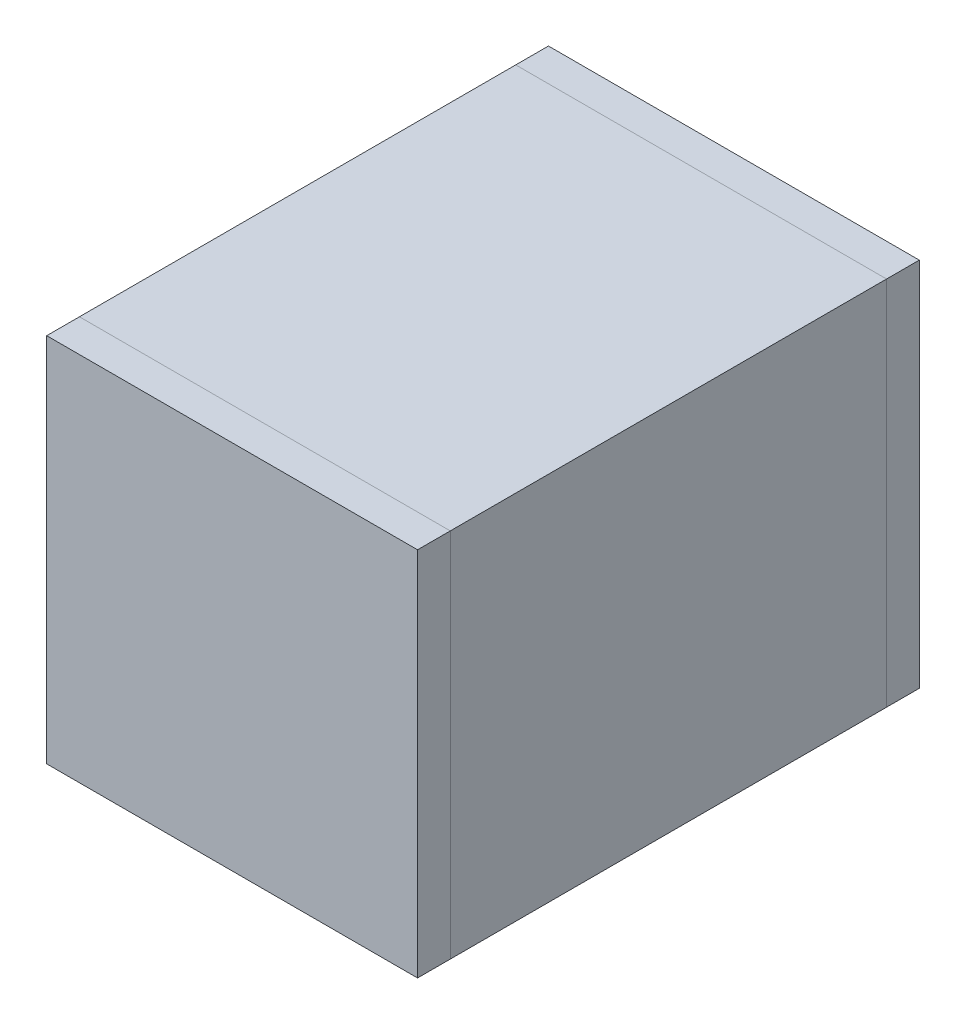
ISO-10303-21;
HEADER;
FILE_DESCRIPTION(('STEP AP214'),'2;1');
FILE_NAME('part.step','',(''),(''),'','','');
FILE_SCHEMA(('AUTOMOTIVE_DESIGN { 1 0 10303 214 1 1 1 1 }'));
ENDSEC;
DATA;
#1=APPLICATION_CONTEXT('core data for automotive mechanical design processes');
#2=APPLICATION_PROTOCOL_DEFINITION('international standard','automotive_design',2000,#1);
#3=PRODUCT_CONTEXT('',#1,'mechanical');
#4=PRODUCT('Part','Part','',(#3));
#5=PRODUCT_RELATED_PRODUCT_CATEGORY('part','',(#4));
#6=PRODUCT_DEFINITION_FORMATION('','',#4);
#7=PRODUCT_DEFINITION_CONTEXT('part definition',#1,'design');
#8=PRODUCT_DEFINITION('design','',#6,#7);
#9=PRODUCT_DEFINITION_SHAPE('','',#8);
#10=(LENGTH_UNIT() NAMED_UNIT(*) SI_UNIT(.MILLI.,.METRE.));
#11=(NAMED_UNIT(*) PLANE_ANGLE_UNIT() SI_UNIT($,.RADIAN.));
#12=(NAMED_UNIT(*) SI_UNIT($,.STERADIAN.) SOLID_ANGLE_UNIT());
#13=UNCERTAINTY_MEASURE_WITH_UNIT(LENGTH_MEASURE(1.E-05),#10,'distance_accuracy_value','');
#14=(GEOMETRIC_REPRESENTATION_CONTEXT(3) GLOBAL_UNCERTAINTY_ASSIGNED_CONTEXT((#13)) GLOBAL_UNIT_ASSIGNED_CONTEXT((#10,
#11,#12)) REPRESENTATION_CONTEXT('',''));
#15=CARTESIAN_POINT('',(0.,0.,0.));
#16=DIRECTION('',(0.,0.,1.));
#17=DIRECTION('',(1.,0.,0.));
#18=AXIS2_PLACEMENT_3D('',#15,#16,#17);
#19=CARTESIAN_POINT('',(17.,17.,35.));
#20=DIRECTION('',(-1.,0.,0.));
#21=DIRECTION('',(0.,-1.,0.));
#22=AXIS2_PLACEMENT_3D('',#19,#20,#21);
#23=PLANE('',#22);
#24=DIRECTION('',(0.,-1.,0.));
#25=VECTOR('',#24,1.);
#26=CARTESIAN_POINT('',(17.,17.,32.));
#27=LINE('',#26,#25);
#28=CARTESIAN_POINT('',(17.,17.,32.));
#29=VERTEX_POINT('',#28);
#30=CARTESIAN_POINT('',(17.,-17.,32.));
#31=VERTEX_POINT('',#30);
#32=EDGE_CURVE('E70',#29,#31,#27,.T.);
#33=ORIENTED_EDGE('',*,*,#32,.F.);
#34=DIRECTION('',(0.,0.,-1.));
#35=VECTOR('',#34,1.);
#36=CARTESIAN_POINT('',(17.,17.,35.));
#37=LINE('',#36,#35);
#38=CARTESIAN_POINT('',(17.,17.,35.));
#39=VERTEX_POINT('',#38);
#40=EDGE_CURVE('E53',#39,#29,#37,.T.);
#41=ORIENTED_EDGE('',*,*,#40,.F.);
#42=DIRECTION('',(0.,1.,0.));
#43=VECTOR('',#42,1.);
#44=CARTESIAN_POINT('',(17.,17.,35.));
#45=LINE('',#44,#43);
#46=CARTESIAN_POINT('',(17.,-17.,35.));
#47=VERTEX_POINT('',#46);
#48=EDGE_CURVE('E120',#47,#39,#45,.T.);
#49=ORIENTED_EDGE('',*,*,#48,.F.);
#50=DIRECTION('',(0.,0.,-1.));
#51=VECTOR('',#50,1.);
#52=CARTESIAN_POINT('',(17.,-17.,35.));
#53=LINE('',#52,#51);
#54=EDGE_CURVE('E65',#47,#31,#53,.T.);
#55=ORIENTED_EDGE('',*,*,#54,.T.);
#56=EDGE_LOOP('',(#33,#41,#49,#55));
#57=FACE_BOUND('',#56,.T.);
#58=ADVANCED_FACE('F49',(#57),#23,.F.);
#59=CARTESIAN_POINT('',(-17.,17.,35.));
#60=DIRECTION('',(0.,-1.,0.));
#61=DIRECTION('',(0.,0.,-1.));
#62=AXIS2_PLACEMENT_3D('',#59,#60,#61);
#63=PLANE('',#62);
#64=DIRECTION('',(1.,0.,0.));
#65=VECTOR('',#64,1.);
#66=CARTESIAN_POINT('',(-17.,17.,32.));
#67=LINE('',#66,#65);
#68=CARTESIAN_POINT('',(-17.,17.,32.));
#69=VERTEX_POINT('',#68);
#70=EDGE_CURVE('E109',#69,#29,#67,.T.);
#71=ORIENTED_EDGE('',*,*,#70,.F.);
#72=DIRECTION('',(0.,0.,-1.));
#73=VECTOR('',#72,1.);
#74=CARTESIAN_POINT('',(-17.,17.,35.));
#75=LINE('',#74,#73);
#76=CARTESIAN_POINT('',(-17.,17.,35.));
#77=VERTEX_POINT('',#76);
#78=EDGE_CURVE('E100',#77,#69,#75,.T.);
#79=ORIENTED_EDGE('',*,*,#78,.F.);
#80=DIRECTION('',(-1.,0.,0.));
#81=VECTOR('',#80,1.);
#82=CARTESIAN_POINT('',(-17.,17.,35.));
#83=LINE('',#82,#81);
#84=EDGE_CURVE('E123',#39,#77,#83,.T.);
#85=ORIENTED_EDGE('',*,*,#84,.F.);
#86=ORIENTED_EDGE('',*,*,#40,.T.);
#87=EDGE_LOOP('',(#71,#79,#85,#86));
#88=FACE_BOUND('',#87,.T.);
#89=ADVANCED_FACE('F129',(#88),#63,.F.);
#90=CARTESIAN_POINT('',(-17.,17.,35.));
#91=DIRECTION('',(1.,0.,0.));
#92=DIRECTION('',(0.,1.,0.));
#93=AXIS2_PLACEMENT_3D('',#90,#91,#92);
#94=PLANE('',#93);
#95=DIRECTION('',(0.,1.,0.));
#96=VECTOR('',#95,1.);
#97=CARTESIAN_POINT('',(-17.,17.,32.));
#98=LINE('',#97,#96);
#99=CARTESIAN_POINT('',(-17.,-17.,32.));
#100=VERTEX_POINT('',#99);
#101=EDGE_CURVE('E104',#100,#69,#98,.T.);
#102=ORIENTED_EDGE('',*,*,#101,.F.);
#103=DIRECTION('',(0.,0.,-1.));
#104=VECTOR('',#103,1.);
#105=CARTESIAN_POINT('',(-17.,-17.,35.));
#106=LINE('',#105,#104);
#107=CARTESIAN_POINT('',(-17.,-17.,35.));
#108=VERTEX_POINT('',#107);
#109=EDGE_CURVE('E92',#108,#100,#106,.T.);
#110=ORIENTED_EDGE('',*,*,#109,.F.);
#111=DIRECTION('',(0.,-1.,0.));
#112=VECTOR('',#111,1.);
#113=CARTESIAN_POINT('',(-17.,17.,35.));
#114=LINE('',#113,#112);
#115=EDGE_CURVE('E125',#77,#108,#114,.T.);
#116=ORIENTED_EDGE('',*,*,#115,.F.);
#117=ORIENTED_EDGE('',*,*,#78,.T.);
#118=EDGE_LOOP('',(#102,#110,#116,#117));
#119=FACE_BOUND('',#118,.T.);
#120=ADVANCED_FACE('F105',(#119),#94,.F.);
#121=CARTESIAN_POINT('',(-17.,-17.,35.));
#122=DIRECTION('',(0.,1.,0.));
#123=DIRECTION('',(0.,0.,1.));
#124=AXIS2_PLACEMENT_3D('',#121,#122,#123);
#125=PLANE('',#124);
#126=DIRECTION('',(-1.,0.,0.));
#127=VECTOR('',#126,1.);
#128=CARTESIAN_POINT('',(-17.,-17.,32.));
#129=LINE('',#128,#127);
#130=EDGE_CURVE('E96',#31,#100,#129,.T.);
#131=ORIENTED_EDGE('',*,*,#130,.F.);
#132=ORIENTED_EDGE('',*,*,#54,.F.);
#133=DIRECTION('',(1.,0.,0.));
#134=VECTOR('',#133,1.);
#135=CARTESIAN_POINT('',(-17.,-17.,35.));
#136=LINE('',#135,#134);
#137=EDGE_CURVE('E97',#108,#47,#136,.T.);
#138=ORIENTED_EDGE('',*,*,#137,.F.);
#139=ORIENTED_EDGE('',*,*,#109,.T.);
#140=EDGE_LOOP('',(#131,#132,#138,#139));
#141=FACE_BOUND('',#140,.T.);
#142=ADVANCED_FACE('F94',(#141),#125,.F.);
#143=CARTESIAN_POINT('',(0.,0.,35.));
#144=DIRECTION('',(0.,0.,1.));
#145=DIRECTION('',(1.,0.,0.));
#146=AXIS2_PLACEMENT_3D('',#143,#144,#145);
#147=PLANE('',#146);
#148=ORIENTED_EDGE('',*,*,#48,.T.);
#149=ORIENTED_EDGE('',*,*,#84,.T.);
#150=ORIENTED_EDGE('',*,*,#115,.T.);
#151=ORIENTED_EDGE('',*,*,#137,.T.);
#152=EDGE_LOOP('',(#148,#149,#150,#151));
#153=FACE_BOUND('',#152,.T.);
#154=ADVANCED_FACE('F131',(#153),#147,.T.);
#155=CARTESIAN_POINT('',(-15.,0.,32.));
#156=DIRECTION('',(0.,0.,1.));
#157=DIRECTION('',(1.,0.,0.));
#158=AXIS2_PLACEMENT_3D('',#155,#156,#157);
#159=PLANE('',#158);
#160=CARTESIAN_POINT('',(0.,0.,32.));
#161=DIRECTION('',(0.,0.,-1.));
#162=DIRECTION('',(-1.,0.,0.));
#163=AXIS2_PLACEMENT_3D('',#160,#161,#162);
#164=CIRCLE('',#163,13.1966056423886);
#165=CARTESIAN_POINT('',(-13.1966056423886,0.,32.));
#166=VERTEX_POINT('',#165);
#167=EDGE_CURVE('E12',#166,#166,#164,.T.);
#168=ORIENTED_EDGE('',*,*,#167,.F.);
#169=EDGE_LOOP('',(#168));
#170=FACE_BOUND('',#169,.T.);
#171=ORIENTED_EDGE('',*,*,#70,.T.);
#172=ORIENTED_EDGE('',*,*,#32,.T.);
#173=ORIENTED_EDGE('',*,*,#130,.T.);
#174=ORIENTED_EDGE('',*,*,#101,.T.);
#175=EDGE_LOOP('',(#171,#172,#173,#174));
#176=FACE_BOUND('',#175,.T.);
#177=ADVANCED_FACE('F51',(#170,#176),#159,.F.);
#178=CARTESIAN_POINT('',(0.,0.,32.));
#179=DIRECTION('',(0.,0.,1.));
#180=DIRECTION('',(1.,0.,0.));
#181=AXIS2_PLACEMENT_3D('',#178,#179,#180);
#182=CONICAL_SURFACE('',#181,13.1966056423886,0.914785110396086);
#183=CARTESIAN_POINT('',(0.,0.,28.7924315309213));
#184=DIRECTION('',(0.,0.,-1.));
#185=DIRECTION('',(-1.,0.,0.));
#186=AXIS2_PLACEMENT_3D('',#183,#184,#185);
#187=CIRCLE('',#186,9.02948854119812);
#188=CARTESIAN_POINT('',(-9.02948854119813,0.,28.7924315309213));
#189=VERTEX_POINT('',#188);
#190=EDGE_CURVE('E380',#189,#189,#187,.T.);
#191=ORIENTED_EDGE('',*,*,#190,.F.);
#192=EDGE_LOOP('',(#191));
#193=FACE_BOUND('',#192,.T.);
#194=ORIENTED_EDGE('',*,*,#167,.T.);
#195=EDGE_LOOP('',(#194));
#196=FACE_BOUND('',#195,.T.);
#197=ADVANCED_FACE('F138',(#193,#196),#182,.T.);
#198=CARTESIAN_POINT('',(0.,0.,28.));
#199=DIRECTION('',(0.,0.,-1.));
#200=DIRECTION('',(-1.,0.,0.));
#201=AXIS2_PLACEMENT_3D('',#198,#199,#200);
#202=TOROIDAL_SURFACE('',#201,9.63944941601031,0.999999999999999);
#203=CARTESIAN_POINT('',(0.,0.,27.2075684690786));
#204=DIRECTION('',(0.,0.,-1.));
#205=DIRECTION('',(-1.,0.,0.));
#206=AXIS2_PLACEMENT_3D('',#203,#204,#205);
#207=CIRCLE('',#206,9.02948854119812);
#208=CARTESIAN_POINT('',(-9.02948854119812,0.,27.2075684690786));
#209=VERTEX_POINT('',#208);
#210=EDGE_CURVE('E377',#209,#209,#207,.T.);
#211=ORIENTED_EDGE('',*,*,#210,.F.);
#212=EDGE_LOOP('',(#211));
#213=FACE_BOUND('',#212,.T.);
#214=ORIENTED_EDGE('',*,*,#190,.T.);
#215=EDGE_LOOP('',(#214));
#216=FACE_BOUND('',#215,.T.);
#217=ADVANCED_FACE('F172',(#213,#216),#202,.F.);
#218=CARTESIAN_POINT('',(0.,0.,27.2075684690786));
#219=DIRECTION('',(0.,0.,-1.));
#220=DIRECTION('',(-1.,0.,0.));
#221=AXIS2_PLACEMENT_3D('',#218,#219,#220);
#222=CONICAL_SURFACE('',#221,9.02948854119812,0.914785110396088);
#223=CARTESIAN_POINT('',(0.,0.,24.));
#224=DIRECTION('',(0.,0.,-1.));
#225=DIRECTION('',(-1.,0.,0.));
#226=AXIS2_PLACEMENT_3D('',#223,#224,#225);
#227=CIRCLE('',#226,13.1966056423886);
#228=CARTESIAN_POINT('',(-13.1966056423886,0.,24.));
#229=VERTEX_POINT('',#228);
#230=EDGE_CURVE('E374',#229,#229,#227,.T.);
#231=ORIENTED_EDGE('',*,*,#230,.F.);
#232=EDGE_LOOP('',(#231));
#233=FACE_BOUND('',#232,.T.);
#234=ORIENTED_EDGE('',*,*,#210,.T.);
#235=EDGE_LOOP('',(#234));
#236=FACE_BOUND('',#235,.T.);
#237=ADVANCED_FACE('F183',(#233,#236),#222,.T.);
#238=CARTESIAN_POINT('',(0.,0.,24.));
#239=DIRECTION('',(0.,0.,1.));
#240=DIRECTION('',(1.,0.,0.));
#241=AXIS2_PLACEMENT_3D('',#238,#239,#240);
#242=CONICAL_SURFACE('',#241,13.1966056423886,0.914785110396087);
#243=CARTESIAN_POINT('',(0.,0.,20.7924315309213));
#244=DIRECTION('',(0.,0.,-1.));
#245=DIRECTION('',(-1.,0.,0.));
#246=AXIS2_PLACEMENT_3D('',#243,#244,#245);
#247=CIRCLE('',#246,9.0294885411981);
#248=CARTESIAN_POINT('',(-9.02948854119811,0.,20.7924315309213));
#249=VERTEX_POINT('',#248);
#250=EDGE_CURVE('E371',#249,#249,#247,.T.);
#251=ORIENTED_EDGE('',*,*,#250,.F.);
#252=EDGE_LOOP('',(#251));
#253=FACE_BOUND('',#252,.T.);
#254=ORIENTED_EDGE('',*,*,#230,.T.);
#255=EDGE_LOOP('',(#254));
#256=FACE_BOUND('',#255,.T.);
#257=ADVANCED_FACE('F193',(#253,#256),#242,.T.);
#258=CARTESIAN_POINT('',(0.,0.,20.));
#259=DIRECTION('',(0.,0.,-1.));
#260=DIRECTION('',(-1.,0.,0.));
#261=AXIS2_PLACEMENT_3D('',#258,#259,#260);
#262=TOROIDAL_SURFACE('',#261,9.6394494160103,1.);
#263=CARTESIAN_POINT('',(0.,0.,19.2075684690786));
#264=DIRECTION('',(0.,0.,-1.));
#265=DIRECTION('',(-1.,0.,0.));
#266=AXIS2_PLACEMENT_3D('',#263,#264,#265);
#267=CIRCLE('',#266,9.0294885411981);
#268=CARTESIAN_POINT('',(-9.02948854119811,0.,19.2075684690786));
#269=VERTEX_POINT('',#268);
#270=EDGE_CURVE('E368',#269,#269,#267,.T.);
#271=ORIENTED_EDGE('',*,*,#270,.F.);
#272=EDGE_LOOP('',(#271));
#273=FACE_BOUND('',#272,.T.);
#274=ORIENTED_EDGE('',*,*,#250,.T.);
#275=EDGE_LOOP('',(#274));
#276=FACE_BOUND('',#275,.T.);
#277=ADVANCED_FACE('F203',(#273,#276),#262,.F.);
#278=CARTESIAN_POINT('',(0.,0.,19.2075684690786));
#279=DIRECTION('',(0.,0.,-1.));
#280=DIRECTION('',(-1.,0.,0.));
#281=AXIS2_PLACEMENT_3D('',#278,#279,#280);
#282=CONICAL_SURFACE('',#281,9.0294885411981,0.914785110396087);
#283=CARTESIAN_POINT('',(0.,0.,16.));
#284=DIRECTION('',(0.,0.,-1.));
#285=DIRECTION('',(-1.,0.,0.));
#286=AXIS2_PLACEMENT_3D('',#283,#284,#285);
#287=CIRCLE('',#286,13.1966056423886);
#288=CARTESIAN_POINT('',(-13.1966056423886,0.,16.));
#289=VERTEX_POINT('',#288);
#290=EDGE_CURVE('E365',#289,#289,#287,.T.);
#291=ORIENTED_EDGE('',*,*,#290,.F.);
#292=EDGE_LOOP('',(#291));
#293=FACE_BOUND('',#292,.T.);
#294=ORIENTED_EDGE('',*,*,#270,.T.);
#295=EDGE_LOOP('',(#294));
#296=FACE_BOUND('',#295,.T.);
#297=ADVANCED_FACE('F213',(#293,#296),#282,.T.);
#298=CARTESIAN_POINT('',(0.,0.,16.));
#299=DIRECTION('',(0.,0.,1.));
#300=DIRECTION('',(1.,0.,0.));
#301=AXIS2_PLACEMENT_3D('',#298,#299,#300);
#302=CONICAL_SURFACE('',#301,13.1966056423886,0.914785110396086);
#303=CARTESIAN_POINT('',(0.,0.,12.7924315309213));
#304=DIRECTION('',(0.,0.,-1.));
#305=DIRECTION('',(-1.,0.,0.));
#306=AXIS2_PLACEMENT_3D('',#303,#304,#305);
#307=CIRCLE('',#306,9.02948854119812);
#308=CARTESIAN_POINT('',(-9.02948854119813,0.,12.7924315309213));
#309=VERTEX_POINT('',#308);
#310=EDGE_CURVE('E362',#309,#309,#307,.T.);
#311=ORIENTED_EDGE('',*,*,#310,.F.);
#312=EDGE_LOOP('',(#311));
#313=FACE_BOUND('',#312,.T.);
#314=ORIENTED_EDGE('',*,*,#290,.T.);
#315=EDGE_LOOP('',(#314));
#316=FACE_BOUND('',#315,.T.);
#317=ADVANCED_FACE('F223',(#313,#316),#302,.T.);
#318=CARTESIAN_POINT('',(0.,0.,12.));
#319=DIRECTION('',(0.,0.,-1.));
#320=DIRECTION('',(-1.,0.,0.));
#321=AXIS2_PLACEMENT_3D('',#318,#319,#320);
#322=TOROIDAL_SURFACE('',#321,9.63944941601032,1.);
#323=CARTESIAN_POINT('',(0.,0.,11.2075684690787));
#324=DIRECTION('',(0.,0.,-1.));
#325=DIRECTION('',(-1.,0.,0.));
#326=AXIS2_PLACEMENT_3D('',#323,#324,#325);
#327=CIRCLE('',#326,9.02948854119812);
#328=CARTESIAN_POINT('',(-9.02948854119813,0.,11.2075684690787));
#329=VERTEX_POINT('',#328);
#330=EDGE_CURVE('E359',#329,#329,#327,.T.);
#331=ORIENTED_EDGE('',*,*,#330,.F.);
#332=EDGE_LOOP('',(#331));
#333=FACE_BOUND('',#332,.T.);
#334=ORIENTED_EDGE('',*,*,#310,.T.);
#335=EDGE_LOOP('',(#334));
#336=FACE_BOUND('',#335,.T.);
#337=ADVANCED_FACE('F233',(#333,#336),#322,.F.);
#338=CARTESIAN_POINT('',(0.,0.,11.2075684690787));
#339=DIRECTION('',(0.,0.,-1.));
#340=DIRECTION('',(-1.,0.,0.));
#341=AXIS2_PLACEMENT_3D('',#338,#339,#340);
#342=CONICAL_SURFACE('',#341,9.02948854119812,0.914785110396085);
#343=CARTESIAN_POINT('',(0.,0.,7.99999999999999));
#344=DIRECTION('',(0.,0.,-1.));
#345=DIRECTION('',(-1.,0.,0.));
#346=AXIS2_PLACEMENT_3D('',#343,#344,#345);
#347=CIRCLE('',#346,13.1966056423886);
#348=CARTESIAN_POINT('',(-13.1966056423886,0.,7.99999999999999));
#349=VERTEX_POINT('',#348);
#350=EDGE_CURVE('E356',#349,#349,#347,.T.);
#351=ORIENTED_EDGE('',*,*,#350,.F.);
#352=EDGE_LOOP('',(#351));
#353=FACE_BOUND('',#352,.T.);
#354=ORIENTED_EDGE('',*,*,#330,.T.);
#355=EDGE_LOOP('',(#354));
#356=FACE_BOUND('',#355,.T.);
#357=ADVANCED_FACE('F243',(#353,#356),#342,.T.);
#358=CARTESIAN_POINT('',(0.,0.,7.99999999999999));
#359=DIRECTION('',(0.,0.,1.));
#360=DIRECTION('',(1.,0.,0.));
#361=AXIS2_PLACEMENT_3D('',#358,#359,#360);
#362=CONICAL_SURFACE('',#361,13.1966056423886,0.914785110396086);
#363=CARTESIAN_POINT('',(0.,0.,4.79243153092134));
#364=DIRECTION('',(0.,0.,-1.));
#365=DIRECTION('',(-1.,0.,0.));
#366=AXIS2_PLACEMENT_3D('',#363,#364,#365);
#367=CIRCLE('',#366,9.02948854119812);
#368=CARTESIAN_POINT('',(-9.02948854119813,0.,4.79243153092134));
#369=VERTEX_POINT('',#368);
#370=EDGE_CURVE('E353',#369,#369,#367,.T.);
#371=ORIENTED_EDGE('',*,*,#370,.F.);
#372=EDGE_LOOP('',(#371));
#373=FACE_BOUND('',#372,.T.);
#374=ORIENTED_EDGE('',*,*,#350,.T.);
#375=EDGE_LOOP('',(#374));
#376=FACE_BOUND('',#375,.T.);
#377=ADVANCED_FACE('F253',(#373,#376),#362,.T.);
#378=CARTESIAN_POINT('',(0.,0.,4.));
#379=DIRECTION('',(0.,0.,-1.));
#380=DIRECTION('',(-1.,0.,0.));
#381=AXIS2_PLACEMENT_3D('',#378,#379,#380);
#382=TOROIDAL_SURFACE('',#381,9.63944941601032,1.);
#383=CARTESIAN_POINT('',(0.,0.,3.20756846907866));
#384=DIRECTION('',(0.,0.,-1.));
#385=DIRECTION('',(-1.,0.,0.));
#386=AXIS2_PLACEMENT_3D('',#383,#384,#385);
#387=CIRCLE('',#386,9.02948854119812);
#388=CARTESIAN_POINT('',(-9.02948854119813,0.,3.20756846907866));
#389=VERTEX_POINT('',#388);
#390=EDGE_CURVE('E350',#389,#389,#387,.T.);
#391=ORIENTED_EDGE('',*,*,#390,.F.);
#392=EDGE_LOOP('',(#391));
#393=FACE_BOUND('',#392,.T.);
#394=ORIENTED_EDGE('',*,*,#370,.T.);
#395=EDGE_LOOP('',(#394));
#396=FACE_BOUND('',#395,.T.);
#397=ADVANCED_FACE('F263',(#393,#396),#382,.F.);
#398=CARTESIAN_POINT('',(0.,0.,3.20756846907866));
#399=DIRECTION('',(0.,0.,-1.));
#400=DIRECTION('',(-1.,0.,0.));
#401=AXIS2_PLACEMENT_3D('',#398,#399,#400);
#402=CONICAL_SURFACE('',#401,9.02948854119812,0.914785110396086);
#403=CARTESIAN_POINT('',(0.,0.,0.));
#404=DIRECTION('',(0.,0.,-1.));
#405=DIRECTION('',(-1.,0.,0.));
#406=AXIS2_PLACEMENT_3D('',#403,#404,#405);
#407=CIRCLE('',#406,13.1966056423886);
#408=CARTESIAN_POINT('',(-13.1966056423886,0.,0.));
#409=VERTEX_POINT('',#408);
#410=EDGE_CURVE('E347',#409,#409,#407,.T.);
#411=ORIENTED_EDGE('',*,*,#410,.F.);
#412=EDGE_LOOP('',(#411));
#413=FACE_BOUND('',#412,.T.);
#414=ORIENTED_EDGE('',*,*,#390,.T.);
#415=EDGE_LOOP('',(#414));
#416=FACE_BOUND('',#415,.T.);
#417=ADVANCED_FACE('F273',(#413,#416),#402,.T.);
#418=CARTESIAN_POINT('',(0.,0.,0.));
#419=DIRECTION('',(0.,0.,1.));
#420=DIRECTION('',(1.,0.,0.));
#421=AXIS2_PLACEMENT_3D('',#418,#419,#420);
#422=CONICAL_SURFACE('',#421,13.1966056423886,0.426329079589017);
#423=CARTESIAN_POINT('',(0.,0.,-2.63461914988726));
#424=DIRECTION('',(0.,0.,-1.));
#425=DIRECTION('',(-1.,0.,0.));
#426=AXIS2_PLACEMENT_3D('',#423,#424,#425);
#427=CIRCLE('',#426,12.);
#428=CARTESIAN_POINT('',(-12.,0.,-2.63461914988726));
#429=VERTEX_POINT('',#428);
#430=EDGE_CURVE('E342',#429,#429,#427,.T.);
#431=ORIENTED_EDGE('',*,*,#430,.F.);
#432=EDGE_LOOP('',(#431));
#433=FACE_BOUND('',#432,.T.);
#434=ORIENTED_EDGE('',*,*,#410,.T.);
#435=EDGE_LOOP('',(#434));
#436=FACE_BOUND('',#435,.T.);
#437=ADVANCED_FACE('F283',(#433,#436),#422,.T.);
#438=CARTESIAN_POINT('',(0.,0.,-49.3485835107112));
#439=DIRECTION('',(0.,0.,-1.));
#440=DIRECTION('',(-1.,0.,0.));
#441=AXIS2_PLACEMENT_3D('',#438,#439,#440);
#442=CYLINDRICAL_SURFACE('',#441,12.);
#443=CARTESIAN_POINT('',(0.,0.,-5.00000000000002));
#444=DIRECTION('',(0.,0.,-1.));
#445=DIRECTION('',(-1.,0.,0.));
#446=AXIS2_PLACEMENT_3D('',#443,#444,#445);
#447=CIRCLE('',#446,12.);
#448=CARTESIAN_POINT('',(-12.,0.,-5.00000000000002));
#449=VERTEX_POINT('',#448);
#450=EDGE_CURVE('E340',#449,#449,#447,.T.);
#451=ORIENTED_EDGE('',*,*,#450,.F.);
#452=EDGE_LOOP('',(#451));
#453=FACE_BOUND('',#452,.T.);
#454=ORIENTED_EDGE('',*,*,#430,.T.);
#455=EDGE_LOOP('',(#454));
#456=FACE_BOUND('',#455,.T.);
#457=ADVANCED_FACE('F293',(#453,#456),#442,.T.);
#458=CARTESIAN_POINT('',(-8.00000000000001,0.,-5.00000000000003));
#459=DIRECTION('',(0.,0.,1.));
#460=DIRECTION('',(1.,0.,0.));
#461=AXIS2_PLACEMENT_3D('',#458,#459,#460);
#462=PLANE('',#461);
#463=CARTESIAN_POINT('',(0.,0.,-5.00000000000002));
#464=DIRECTION('',(0.,0.,-1.));
#465=DIRECTION('',(-1.,0.,0.));
#466=AXIS2_PLACEMENT_3D('',#463,#464,#465);
#467=CIRCLE('',#466,8.);
#468=CARTESIAN_POINT('',(-8.00000000000001,0.,-5.00000000000002));
#469=VERTEX_POINT('',#468);
#470=EDGE_CURVE('E114',#469,#469,#467,.T.);
#471=ORIENTED_EDGE('',*,*,#470,.F.);
#472=EDGE_LOOP('',(#471));
#473=FACE_BOUND('',#472,.T.);
#474=ORIENTED_EDGE('',*,*,#450,.T.);
#475=EDGE_LOOP('',(#474));
#476=FACE_BOUND('',#475,.T.);
#477=ADVANCED_FACE('F303',(#473,#476),#462,.F.);
#478=CARTESIAN_POINT('',(0.,0.,-49.3485835107112));
#479=DIRECTION('',(0.,0.,-1.));
#480=DIRECTION('',(-1.,0.,0.));
#481=AXIS2_PLACEMENT_3D('',#478,#479,#480);
#482=CYLINDRICAL_SURFACE('',#481,8.);
#483=CARTESIAN_POINT('',(0.,0.,-8.00000000000003));
#484=DIRECTION('',(0.,0.,-1.));
#485=DIRECTION('',(-1.,0.,0.));
#486=AXIS2_PLACEMENT_3D('',#483,#484,#485);
#487=CIRCLE('',#486,8.);
#488=CARTESIAN_POINT('',(-8.00000000000001,0.,-8.00000000000003));
#489=VERTEX_POINT('',#488);
#490=EDGE_CURVE('E111',#489,#489,#487,.T.);
#491=ORIENTED_EDGE('',*,*,#490,.F.);
#492=EDGE_LOOP('',(#491));
#493=FACE_BOUND('',#492,.T.);
#494=ORIENTED_EDGE('',*,*,#470,.T.);
#495=EDGE_LOOP('',(#494));
#496=FACE_BOUND('',#495,.T.);
#497=ADVANCED_FACE('F313',(#493,#496),#482,.T.);
#498=CARTESIAN_POINT('',(-11.3665165268692,0.,-8.00000000000003));
#499=DIRECTION('',(0.,0.,1.));
#500=DIRECTION('',(1.,0.,0.));
#501=AXIS2_PLACEMENT_3D('',#498,#499,#500);
#502=PLANE('',#501);
#503=ORIENTED_EDGE('',*,*,#490,.T.);
#504=EDGE_LOOP('',(#503));
#505=FACE_BOUND('',#504,.T.);
#506=ADVANCED_FACE('F323',(#505),#502,.F.);
#507=CLOSED_SHELL('',(#58,#89,#120,#142,#154,#177,#197,#217,#237,#257,#277,#297,#317,#337,#357,
#377,#397,#417,#437,#457,#477,#497,#506));
#508=MANIFOLD_SOLID_BREP('B2',#507);
#509=CARTESIAN_POINT('',(-11.3665165268692,0.,-8.00000000000003));
#510=DIRECTION('',(0.,0.,1.));
#511=DIRECTION('',(1.,0.,0.));
#512=AXIS2_PLACEMENT_3D('',#509,#510,#511);
#513=PLANE('',#512);
#514=DIRECTION('',(0.,-1.,0.));
#515=VECTOR('',#514,1.);
#516=CARTESIAN_POINT('',(-17.,17.,-8.00000000000003));
#517=LINE('',#516,#515);
#518=CARTESIAN_POINT('',(-17.,17.,-8.00000000000003));
#519=VERTEX_POINT('',#518);
#520=CARTESIAN_POINT('',(-17.,-17.,-8.00000000000003));
#521=VERTEX_POINT('',#520);
#522=EDGE_CURVE('E494',#519,#521,#517,.T.);
#523=ORIENTED_EDGE('',*,*,#522,.T.);
#524=DIRECTION('',(1.,0.,0.));
#525=VECTOR('',#524,1.);
#526=CARTESIAN_POINT('',(-17.,-17.,-8.00000000000003));
#527=LINE('',#526,#525);
#528=CARTESIAN_POINT('',(17.,-17.,-8.00000000000003));
#529=VERTEX_POINT('',#528);
#530=EDGE_CURVE('E492',#521,#529,#527,.T.);
#531=ORIENTED_EDGE('',*,*,#530,.T.);
#532=DIRECTION('',(0.,1.,0.));
#533=VECTOR('',#532,1.);
#534=CARTESIAN_POINT('',(17.,17.,-8.00000000000003));
#535=LINE('',#534,#533);
#536=CARTESIAN_POINT('',(17.,17.,-8.00000000000003));
#537=VERTEX_POINT('',#536);
#538=EDGE_CURVE('E475',#529,#537,#535,.T.);
#539=ORIENTED_EDGE('',*,*,#538,.T.);
#540=DIRECTION('',(-1.,0.,0.));
#541=VECTOR('',#540,1.);
#542=CARTESIAN_POINT('',(-17.,17.,-8.00000000000003));
#543=LINE('',#542,#541);
#544=EDGE_CURVE('E486',#537,#519,#543,.T.);
#545=ORIENTED_EDGE('',*,*,#544,.T.);
#546=EDGE_LOOP('',(#523,#531,#539,#545));
#547=FACE_BOUND('',#546,.T.);
#548=ADVANCED_FACE('F436',(#547),#513,.T.);
#549=CARTESIAN_POINT('',(0.,0.,-11.));
#550=DIRECTION('',(0.,0.,1.));
#551=DIRECTION('',(1.,0.,0.));
#552=AXIS2_PLACEMENT_3D('',#549,#550,#551);
#553=PLANE('',#552);
#554=DIRECTION('',(0.,1.,0.));
#555=VECTOR('',#554,1.);
#556=CARTESIAN_POINT('',(17.,17.,-11.));
#557=LINE('',#556,#555);
#558=CARTESIAN_POINT('',(17.,-17.,-11.));
#559=VERTEX_POINT('',#558);
#560=CARTESIAN_POINT('',(17.,17.,-11.));
#561=VERTEX_POINT('',#560);
#562=EDGE_CURVE('E478',#559,#561,#557,.T.);
#563=ORIENTED_EDGE('',*,*,#562,.F.);
#564=DIRECTION('',(1.,0.,0.));
#565=VECTOR('',#564,1.);
#566=CARTESIAN_POINT('',(-17.,-17.,-11.));
#567=LINE('',#566,#565);
#568=CARTESIAN_POINT('',(-17.,-17.,-11.));
#569=VERTEX_POINT('',#568);
#570=EDGE_CURVE('E47',#569,#559,#567,.T.);
#571=ORIENTED_EDGE('',*,*,#570,.F.);
#572=DIRECTION('',(0.,-1.,0.));
#573=VECTOR('',#572,1.);
#574=CARTESIAN_POINT('',(-17.,17.,-11.));
#575=LINE('',#574,#573);
#576=CARTESIAN_POINT('',(-17.,17.,-11.));
#577=VERTEX_POINT('',#576);
#578=EDGE_CURVE('E498',#577,#569,#575,.T.);
#579=ORIENTED_EDGE('',*,*,#578,.F.);
#580=DIRECTION('',(-1.,0.,0.));
#581=VECTOR('',#580,1.);
#582=CARTESIAN_POINT('',(-17.,17.,-11.));
#583=LINE('',#582,#581);
#584=EDGE_CURVE('E482',#561,#577,#583,.T.);
#585=ORIENTED_EDGE('',*,*,#584,.F.);
#586=EDGE_LOOP('',(#563,#571,#579,#585));
#587=FACE_BOUND('',#586,.T.);
#588=ADVANCED_FACE('F510',(#587),#553,.F.);
#589=CARTESIAN_POINT('',(17.,17.,35.));
#590=DIRECTION('',(-1.,0.,0.));
#591=DIRECTION('',(0.,-1.,0.));
#592=AXIS2_PLACEMENT_3D('',#589,#590,#591);
#593=PLANE('',#592);
#594=ORIENTED_EDGE('',*,*,#538,.F.);
#595=DIRECTION('',(0.,0.,-1.));
#596=VECTOR('',#595,1.);
#597=CARTESIAN_POINT('',(17.,-17.,35.));
#598=LINE('',#597,#596);
#599=EDGE_CURVE('E452',#529,#559,#598,.T.);
#600=ORIENTED_EDGE('',*,*,#599,.T.);
#601=ORIENTED_EDGE('',*,*,#562,.T.);
#602=DIRECTION('',(0.,0.,-1.));
#603=VECTOR('',#602,1.);
#604=CARTESIAN_POINT('',(17.,17.,35.));
#605=LINE('',#604,#603);
#606=EDGE_CURVE('E471',#537,#561,#605,.T.);
#607=ORIENTED_EDGE('',*,*,#606,.F.);
#608=EDGE_LOOP('',(#594,#600,#601,#607));
#609=FACE_BOUND('',#608,.T.);
#610=ADVANCED_FACE('F473',(#609),#593,.F.);
#611=CARTESIAN_POINT('',(-17.,17.,35.));
#612=DIRECTION('',(0.,-1.,0.));
#613=DIRECTION('',(0.,0.,-1.));
#614=AXIS2_PLACEMENT_3D('',#611,#612,#613);
#615=PLANE('',#614);
#616=ORIENTED_EDGE('',*,*,#544,.F.);
#617=ORIENTED_EDGE('',*,*,#606,.T.);
#618=ORIENTED_EDGE('',*,*,#584,.T.);
#619=DIRECTION('',(0.,0.,-1.));
#620=VECTOR('',#619,1.);
#621=CARTESIAN_POINT('',(-17.,17.,35.));
#622=LINE('',#621,#620);
#623=EDGE_CURVE('E488',#519,#577,#622,.T.);
#624=ORIENTED_EDGE('',*,*,#623,.F.);
#625=EDGE_LOOP('',(#616,#617,#618,#624));
#626=FACE_BOUND('',#625,.T.);
#627=ADVANCED_FACE('F487',(#626),#615,.F.);
#628=CARTESIAN_POINT('',(-17.,17.,35.));
#629=DIRECTION('',(1.,0.,0.));
#630=DIRECTION('',(0.,1.,0.));
#631=AXIS2_PLACEMENT_3D('',#628,#629,#630);
#632=PLANE('',#631);
#633=ORIENTED_EDGE('',*,*,#522,.F.);
#634=ORIENTED_EDGE('',*,*,#623,.T.);
#635=ORIENTED_EDGE('',*,*,#578,.T.);
#636=DIRECTION('',(0.,0.,-1.));
#637=VECTOR('',#636,1.);
#638=CARTESIAN_POINT('',(-17.,-17.,35.));
#639=LINE('',#638,#637);
#640=EDGE_CURVE('E439',#521,#569,#639,.T.);
#641=ORIENTED_EDGE('',*,*,#640,.F.);
#642=EDGE_LOOP('',(#633,#634,#635,#641));
#643=FACE_BOUND('',#642,.T.);
#644=ADVANCED_FACE('F506',(#643),#632,.F.);
#645=CARTESIAN_POINT('',(-17.,-17.,35.));
#646=DIRECTION('',(0.,1.,0.));
#647=DIRECTION('',(0.,0.,1.));
#648=AXIS2_PLACEMENT_3D('',#645,#646,#647);
#649=PLANE('',#648);
#650=ORIENTED_EDGE('',*,*,#530,.F.);
#651=ORIENTED_EDGE('',*,*,#640,.T.);
#652=ORIENTED_EDGE('',*,*,#570,.T.);
#653=ORIENTED_EDGE('',*,*,#599,.F.);
#654=EDGE_LOOP('',(#650,#651,#652,#653));
#655=FACE_BOUND('',#654,.T.);
#656=ADVANCED_FACE('F508',(#655),#649,.F.);
#657=CLOSED_SHELL('',(#548,#588,#610,#627,#644,#656));
#658=MANIFOLD_SOLID_BREP('B6',#657);
#659=CARTESIAN_POINT('',(0.,0.,12.));
#660=DIRECTION('',(0.,0.,1.));
#661=DIRECTION('',(1.,0.,0.));
#662=AXIS2_PLACEMENT_3D('',#659,#660,#661);
#663=CONICAL_SURFACE('',#662,9.80339435761135,0.914785110396087);
#664=CARTESIAN_POINT('',(0.,0.,16.));
#665=DIRECTION('',(0.,0.,-1.));
#666=DIRECTION('',(-1.,0.,0.));
#667=AXIS2_PLACEMENT_3D('',#664,#665,#666);
#668=CIRCLE('',#667,15.);
#669=CARTESIAN_POINT('',(-15.,0.,16.));
#670=VERTEX_POINT('',#669);
#671=EDGE_CURVE('E645',#670,#670,#668,.T.);
#672=ORIENTED_EDGE('',*,*,#671,.F.);
#673=EDGE_LOOP('',(#672));
#674=FACE_BOUND('',#673,.T.);
#675=CARTESIAN_POINT('',(0.,0.,12.));
#676=DIRECTION('',(0.,0.,-1.));
#677=DIRECTION('',(-1.,0.,0.));
#678=AXIS2_PLACEMENT_3D('',#675,#676,#677);
#679=CIRCLE('',#678,9.80339435761135);
#680=CARTESIAN_POINT('',(-9.80339435761135,0.,12.));
#681=VERTEX_POINT('',#680);
#682=EDGE_CURVE('E648',#681,#681,#679,.T.);
#683=ORIENTED_EDGE('',*,*,#682,.T.);
#684=EDGE_LOOP('',(#683));
#685=FACE_BOUND('',#684,.T.);
#686=ADVANCED_FACE('F559',(#674,#685),#663,.F.);
#687=CARTESIAN_POINT('',(0.,0.,7.99999999999999));
#688=DIRECTION('',(0.,0.,-1.));
#689=DIRECTION('',(-1.,0.,0.));
#690=AXIS2_PLACEMENT_3D('',#687,#688,#689);
#691=CONICAL_SURFACE('',#690,15.,0.914785110396086);
#692=ORIENTED_EDGE('',*,*,#682,.F.);
#693=EDGE_LOOP('',(#692));
#694=FACE_BOUND('',#693,.T.);
#695=CARTESIAN_POINT('',(0.,0.,7.99999999999999));
#696=DIRECTION('',(0.,0.,-1.));
#697=DIRECTION('',(-1.,0.,0.));
#698=AXIS2_PLACEMENT_3D('',#695,#696,#697);
#699=CIRCLE('',#698,15.);
#700=CARTESIAN_POINT('',(-15.,0.,7.99999999999999));
#701=VERTEX_POINT('',#700);
#702=EDGE_CURVE('E651',#701,#701,#699,.T.);
#703=ORIENTED_EDGE('',*,*,#702,.T.);
#704=EDGE_LOOP('',(#703));
#705=FACE_BOUND('',#704,.T.);
#706=ADVANCED_FACE('F692',(#694,#705),#691,.F.);
#707=CARTESIAN_POINT('',(0.,0.,4.));
#708=DIRECTION('',(0.,0.,1.));
#709=DIRECTION('',(1.,0.,0.));
#710=AXIS2_PLACEMENT_3D('',#707,#708,#709);
#711=CONICAL_SURFACE('',#710,9.80339435761135,0.914785110396086);
#712=ORIENTED_EDGE('',*,*,#702,.F.);
#713=EDGE_LOOP('',(#712));
#714=FACE_BOUND('',#713,.T.);
#715=CARTESIAN_POINT('',(0.,0.,4.));
#716=DIRECTION('',(0.,0.,-1.));
#717=DIRECTION('',(-1.,0.,0.));
#718=AXIS2_PLACEMENT_3D('',#715,#716,#717);
#719=CIRCLE('',#718,9.80339435761135);
#720=CARTESIAN_POINT('',(-9.80339435761135,0.,4.));
#721=VERTEX_POINT('',#720);
#722=EDGE_CURVE('E654',#721,#721,#719,.T.);
#723=ORIENTED_EDGE('',*,*,#722,.T.);
#724=EDGE_LOOP('',(#723));
#725=FACE_BOUND('',#724,.T.);
#726=ADVANCED_FACE('F687',(#714,#725),#711,.F.);
#727=CARTESIAN_POINT('',(0.,0.,0.));
#728=DIRECTION('',(0.,0.,-1.));
#729=DIRECTION('',(-1.,0.,0.));
#730=AXIS2_PLACEMENT_3D('',#727,#728,#729);
#731=CONICAL_SURFACE('',#730,15.,0.914785110396085);
#732=ORIENTED_EDGE('',*,*,#722,.F.);
#733=EDGE_LOOP('',(#732));
#734=FACE_BOUND('',#733,.T.);
#735=CARTESIAN_POINT('',(0.,0.,0.));
#736=DIRECTION('',(0.,0.,-1.));
#737=DIRECTION('',(-1.,0.,0.));
#738=AXIS2_PLACEMENT_3D('',#735,#736,#737);
#739=CIRCLE('',#738,15.);
#740=CARTESIAN_POINT('',(-15.,0.,0.));
#741=VERTEX_POINT('',#740);
#742=EDGE_CURVE('E627',#741,#741,#739,.T.);
#743=ORIENTED_EDGE('',*,*,#742,.T.);
#744=EDGE_LOOP('',(#743));
#745=FACE_BOUND('',#744,.T.);
#746=ADVANCED_FACE('F677',(#734,#745),#731,.F.);
#747=CARTESIAN_POINT('',(0.,0.,-8.00000000000003));
#748=DIRECTION('',(0.,0.,1.));
#749=DIRECTION('',(1.,0.,0.));
#750=AXIS2_PLACEMENT_3D('',#747,#748,#749);
#751=CONICAL_SURFACE('',#750,11.3665165268692,0.426329079589016);
#752=ORIENTED_EDGE('',*,*,#742,.F.);
#753=EDGE_LOOP('',(#752));
#754=FACE_BOUND('',#753,.T.);
#755=CARTESIAN_POINT('',(0.,0.,-8.00000000000003));
#756=DIRECTION('',(0.,0.,1.));
#757=DIRECTION('',(1.,0.,0.));
#758=AXIS2_PLACEMENT_3D('',#755,#756,#757);
#759=CIRCLE('',#758,11.3665165268692);
#760=CARTESIAN_POINT('',(11.3665165268692,0.,-8.00000000000003));
#761=VERTEX_POINT('',#760);
#762=EDGE_CURVE('E434',#761,#761,#759,.F.);
#763=ORIENTED_EDGE('',*,*,#762,.T.);
#764=EDGE_LOOP('',(#763));
#765=FACE_BOUND('',#764,.T.);
#766=ADVANCED_FACE('F674',(#754,#765),#751,.F.);
#767=CARTESIAN_POINT('',(0.,0.,16.));
#768=DIRECTION('',(0.,0.,-1.));
#769=DIRECTION('',(-1.,0.,0.));
#770=AXIS2_PLACEMENT_3D('',#767,#768,#769);
#771=CONICAL_SURFACE('',#770,15.,0.914785110396086);
#772=CARTESIAN_POINT('',(0.,0.,20.));
#773=DIRECTION('',(0.,0.,-1.));
#774=DIRECTION('',(-1.,0.,0.));
#775=AXIS2_PLACEMENT_3D('',#772,#773,#774);
#776=CIRCLE('',#775,9.80339435761135);
#777=CARTESIAN_POINT('',(-9.80339435761135,0.,20.));
#778=VERTEX_POINT('',#777);
#779=EDGE_CURVE('E642',#778,#778,#776,.T.);
#780=ORIENTED_EDGE('',*,*,#779,.F.);
#781=EDGE_LOOP('',(#780));
#782=FACE_BOUND('',#781,.T.);
#783=ORIENTED_EDGE('',*,*,#671,.T.);
#784=EDGE_LOOP('',(#783));
#785=FACE_BOUND('',#784,.T.);
#786=ADVANCED_FACE('F676',(#782,#785),#771,.F.);
#787=CARTESIAN_POINT('',(0.,0.,20.));
#788=DIRECTION('',(0.,0.,1.));
#789=DIRECTION('',(1.,0.,0.));
#790=AXIS2_PLACEMENT_3D('',#787,#788,#789);
#791=CONICAL_SURFACE('',#790,9.80339435761135,0.914785110396087);
#792=CARTESIAN_POINT('',(0.,0.,24.));
#793=DIRECTION('',(0.,0.,-1.));
#794=DIRECTION('',(-1.,0.,0.));
#795=AXIS2_PLACEMENT_3D('',#792,#793,#794);
#796=CIRCLE('',#795,15.);
#797=CARTESIAN_POINT('',(-15.,0.,24.));
#798=VERTEX_POINT('',#797);
#799=EDGE_CURVE('E636',#798,#798,#796,.T.);
#800=ORIENTED_EDGE('',*,*,#799,.F.);
#801=EDGE_LOOP('',(#800));
#802=FACE_BOUND('',#801,.T.);
#803=ORIENTED_EDGE('',*,*,#779,.T.);
#804=EDGE_LOOP('',(#803));
#805=FACE_BOUND('',#804,.T.);
#806=ADVANCED_FACE('F684',(#802,#805),#791,.F.);
#807=CARTESIAN_POINT('',(0.,0.,24.));
#808=DIRECTION('',(0.,0.,-1.));
#809=DIRECTION('',(-1.,0.,0.));
#810=AXIS2_PLACEMENT_3D('',#807,#808,#809);
#811=CONICAL_SURFACE('',#810,15.,0.914785110396086);
#812=CARTESIAN_POINT('',(0.,0.,28.));
#813=DIRECTION('',(0.,0.,-1.));
#814=DIRECTION('',(-1.,0.,0.));
#815=AXIS2_PLACEMENT_3D('',#812,#813,#814);
#816=CIRCLE('',#815,9.80339435761135);
#817=CARTESIAN_POINT('',(-9.80339435761135,0.,28.));
#818=VERTEX_POINT('',#817);
#819=EDGE_CURVE('E631',#818,#818,#816,.T.);
#820=ORIENTED_EDGE('',*,*,#819,.F.);
#821=EDGE_LOOP('',(#820));
#822=FACE_BOUND('',#821,.T.);
#823=ORIENTED_EDGE('',*,*,#799,.T.);
#824=EDGE_LOOP('',(#823));
#825=FACE_BOUND('',#824,.T.);
#826=ADVANCED_FACE('F765',(#822,#825),#811,.F.);
#827=CARTESIAN_POINT('',(0.,0.,28.));
#828=DIRECTION('',(0.,0.,1.));
#829=DIRECTION('',(1.,0.,0.));
#830=AXIS2_PLACEMENT_3D('',#827,#828,#829);
#831=CONICAL_SURFACE('',#830,9.80339435761135,0.914785110396087);
#832=CARTESIAN_POINT('',(0.,0.,32.));
#833=DIRECTION('',(0.,0.,-1.));
#834=DIRECTION('',(-1.,0.,0.));
#835=AXIS2_PLACEMENT_3D('',#832,#833,#834);
#836=CIRCLE('',#835,15.);
#837=CARTESIAN_POINT('',(-15.,0.,32.));
#838=VERTEX_POINT('',#837);
#839=EDGE_CURVE('E625',#838,#838,#836,.T.);
#840=ORIENTED_EDGE('',*,*,#839,.F.);
#841=EDGE_LOOP('',(#840));
#842=FACE_BOUND('',#841,.T.);
#843=ORIENTED_EDGE('',*,*,#819,.T.);
#844=EDGE_LOOP('',(#843));
#845=FACE_BOUND('',#844,.T.);
#846=ADVANCED_FACE('F731',(#842,#845),#831,.F.);
#847=CARTESIAN_POINT('',(-15.,0.,32.));
#848=DIRECTION('',(0.,0.,-1.));
#849=DIRECTION('',(-1.,0.,0.));
#850=AXIS2_PLACEMENT_3D('',#847,#848,#849);
#851=PLANE('',#850);
#852=ORIENTED_EDGE('',*,*,#839,.T.);
#853=EDGE_LOOP('',(#852));
#854=FACE_BOUND('',#853,.T.);
#855=DIRECTION('',(1.,0.,0.));
#856=VECTOR('',#855,1.);
#857=CARTESIAN_POINT('',(-17.,17.,32.));
#858=LINE('',#857,#856);
#859=CARTESIAN_POINT('',(-17.,17.,32.));
#860=VERTEX_POINT('',#859);
#861=CARTESIAN_POINT('',(17.,17.,32.));
#862=VERTEX_POINT('',#861);
#863=EDGE_CURVE('E596',#860,#862,#858,.T.);
#864=ORIENTED_EDGE('',*,*,#863,.F.);
#865=DIRECTION('',(0.,1.,0.));
#866=VECTOR('',#865,1.);
#867=CARTESIAN_POINT('',(-17.,17.,32.));
#868=LINE('',#867,#866);
#869=CARTESIAN_POINT('',(-17.,-17.,32.));
#870=VERTEX_POINT('',#869);
#871=EDGE_CURVE('E599',#870,#860,#868,.T.);
#872=ORIENTED_EDGE('',*,*,#871,.F.);
#873=DIRECTION('',(-1.,0.,0.));
#874=VECTOR('',#873,1.);
#875=CARTESIAN_POINT('',(-17.,-17.,32.));
#876=LINE('',#875,#874);
#877=CARTESIAN_POINT('',(17.,-17.,32.));
#878=VERTEX_POINT('',#877);
#879=EDGE_CURVE('E621',#878,#870,#876,.T.);
#880=ORIENTED_EDGE('',*,*,#879,.F.);
#881=DIRECTION('',(0.,-1.,0.));
#882=VECTOR('',#881,1.);
#883=CARTESIAN_POINT('',(17.,17.,32.));
#884=LINE('',#883,#882);
#885=EDGE_CURVE('E602',#862,#878,#884,.T.);
#886=ORIENTED_EDGE('',*,*,#885,.F.);
#887=EDGE_LOOP('',(#864,#872,#880,#886));
#888=FACE_BOUND('',#887,.T.);
#889=ADVANCED_FACE('F561',(#854,#888),#851,.F.);
#890=CARTESIAN_POINT('',(17.,17.,35.));
#891=DIRECTION('',(-1.,0.,0.));
#892=DIRECTION('',(0.,-1.,0.));
#893=AXIS2_PLACEMENT_3D('',#890,#891,#892);
#894=PLANE('',#893);
#895=DIRECTION('',(0.,0.,-1.));
#896=VECTOR('',#895,1.);
#897=CARTESIAN_POINT('',(17.,-17.,35.));
#898=LINE('',#897,#896);
#899=CARTESIAN_POINT('',(17.,-17.,-8.00000000000003));
#900=VERTEX_POINT('',#899);
#901=EDGE_CURVE('E658',#878,#900,#898,.T.);
#902=ORIENTED_EDGE('',*,*,#901,.T.);
#903=DIRECTION('',(0.,1.,0.));
#904=VECTOR('',#903,1.);
#905=CARTESIAN_POINT('',(17.,17.,-8.00000000000003));
#906=LINE('',#905,#904);
#907=CARTESIAN_POINT('',(17.,17.,-8.00000000000003));
#908=VERTEX_POINT('',#907);
#909=EDGE_CURVE('E563',#900,#908,#906,.T.);
#910=ORIENTED_EDGE('',*,*,#909,.T.);
#911=DIRECTION('',(0.,0.,-1.));
#912=VECTOR('',#911,1.);
#913=CARTESIAN_POINT('',(17.,17.,35.));
#914=LINE('',#913,#912);
#915=EDGE_CURVE('E606',#862,#908,#914,.T.);
#916=ORIENTED_EDGE('',*,*,#915,.F.);
#917=ORIENTED_EDGE('',*,*,#885,.T.);
#918=EDGE_LOOP('',(#902,#910,#916,#917));
#919=FACE_BOUND('',#918,.T.);
#920=ADVANCED_FACE('F662',(#919),#894,.F.);
#921=CARTESIAN_POINT('',(-17.,17.,35.));
#922=DIRECTION('',(0.,-1.,0.));
#923=DIRECTION('',(0.,0.,-1.));
#924=AXIS2_PLACEMENT_3D('',#921,#922,#923);
#925=PLANE('',#924);
#926=ORIENTED_EDGE('',*,*,#915,.T.);
#927=DIRECTION('',(-1.,0.,0.));
#928=VECTOR('',#927,1.);
#929=CARTESIAN_POINT('',(-17.,17.,-8.00000000000003));
#930=LINE('',#929,#928);
#931=CARTESIAN_POINT('',(-17.,17.,-8.00000000000003));
#932=VERTEX_POINT('',#931);
#933=EDGE_CURVE('E612',#908,#932,#930,.T.);
#934=ORIENTED_EDGE('',*,*,#933,.T.);
#935=DIRECTION('',(0.,0.,-1.));
#936=VECTOR('',#935,1.);
#937=CARTESIAN_POINT('',(-17.,17.,35.));
#938=LINE('',#937,#936);
#939=EDGE_CURVE('E607',#860,#932,#938,.T.);
#940=ORIENTED_EDGE('',*,*,#939,.F.);
#941=ORIENTED_EDGE('',*,*,#863,.T.);
#942=EDGE_LOOP('',(#926,#934,#940,#941));
#943=FACE_BOUND('',#942,.T.);
#944=ADVANCED_FACE('F611',(#943),#925,.F.);
#945=CARTESIAN_POINT('',(-17.,17.,35.));
#946=DIRECTION('',(1.,0.,0.));
#947=DIRECTION('',(0.,1.,0.));
#948=AXIS2_PLACEMENT_3D('',#945,#946,#947);
#949=PLANE('',#948);
#950=ORIENTED_EDGE('',*,*,#939,.T.);
#951=DIRECTION('',(0.,-1.,0.));
#952=VECTOR('',#951,1.);
#953=CARTESIAN_POINT('',(-17.,17.,-8.00000000000003));
#954=LINE('',#953,#952);
#955=CARTESIAN_POINT('',(-17.,-17.,-8.00000000000003));
#956=VERTEX_POINT('',#955);
#957=EDGE_CURVE('E665',#932,#956,#954,.T.);
#958=ORIENTED_EDGE('',*,*,#957,.T.);
#959=DIRECTION('',(0.,0.,-1.));
#960=VECTOR('',#959,1.);
#961=CARTESIAN_POINT('',(-17.,-17.,35.));
#962=LINE('',#961,#960);
#963=EDGE_CURVE('E618',#870,#956,#962,.T.);
#964=ORIENTED_EDGE('',*,*,#963,.F.);
#965=ORIENTED_EDGE('',*,*,#871,.T.);
#966=EDGE_LOOP('',(#950,#958,#964,#965));
#967=FACE_BOUND('',#966,.T.);
#968=ADVANCED_FACE('F616',(#967),#949,.F.);
#969=CARTESIAN_POINT('',(-17.,-17.,35.));
#970=DIRECTION('',(0.,1.,0.));
#971=DIRECTION('',(0.,0.,1.));
#972=AXIS2_PLACEMENT_3D('',#969,#970,#971);
#973=PLANE('',#972);
#974=ORIENTED_EDGE('',*,*,#963,.T.);
#975=DIRECTION('',(1.,0.,0.));
#976=VECTOR('',#975,1.);
#977=CARTESIAN_POINT('',(-17.,-17.,-8.00000000000003));
#978=LINE('',#977,#976);
#979=EDGE_CURVE('E569',#956,#900,#978,.T.);
#980=ORIENTED_EDGE('',*,*,#979,.T.);
#981=ORIENTED_EDGE('',*,*,#901,.F.);
#982=ORIENTED_EDGE('',*,*,#879,.T.);
#983=EDGE_LOOP('',(#974,#980,#981,#982));
#984=FACE_BOUND('',#983,.T.);
#985=ADVANCED_FACE('F664',(#984),#973,.F.);
#986=CARTESIAN_POINT('',(-11.3665165268692,0.,-8.00000000000003));
#987=DIRECTION('',(0.,0.,1.));
#988=DIRECTION('',(1.,0.,0.));
#989=AXIS2_PLACEMENT_3D('',#986,#987,#988);
#990=PLANE('',#989);
#991=ORIENTED_EDGE('',*,*,#957,.F.);
#992=ORIENTED_EDGE('',*,*,#933,.F.);
#993=ORIENTED_EDGE('',*,*,#909,.F.);
#994=ORIENTED_EDGE('',*,*,#979,.F.);
#995=EDGE_LOOP('',(#991,#992,#993,#994));
#996=FACE_BOUND('',#995,.T.);
#997=ORIENTED_EDGE('',*,*,#762,.F.);
#998=EDGE_LOOP('',(#997));
#999=FACE_BOUND('',#998,.T.);
#1000=ADVANCED_FACE('F668',(#996,#999),#990,.F.);
#1001=CLOSED_SHELL('',(#686,#706,#726,#746,#766,#786,#806,#826,#846,#889,#920,#944,#968,#985,#1000));
#1002=MANIFOLD_SOLID_BREP('B41',#1001);
#1003=ADVANCED_BREP_SHAPE_REPRESENTATION('',(#18,#508,#658,#1002),#14);
#1004=SHAPE_DEFINITION_REPRESENTATION(#9,#1003);
ENDSEC;
END-ISO-10303-21;
